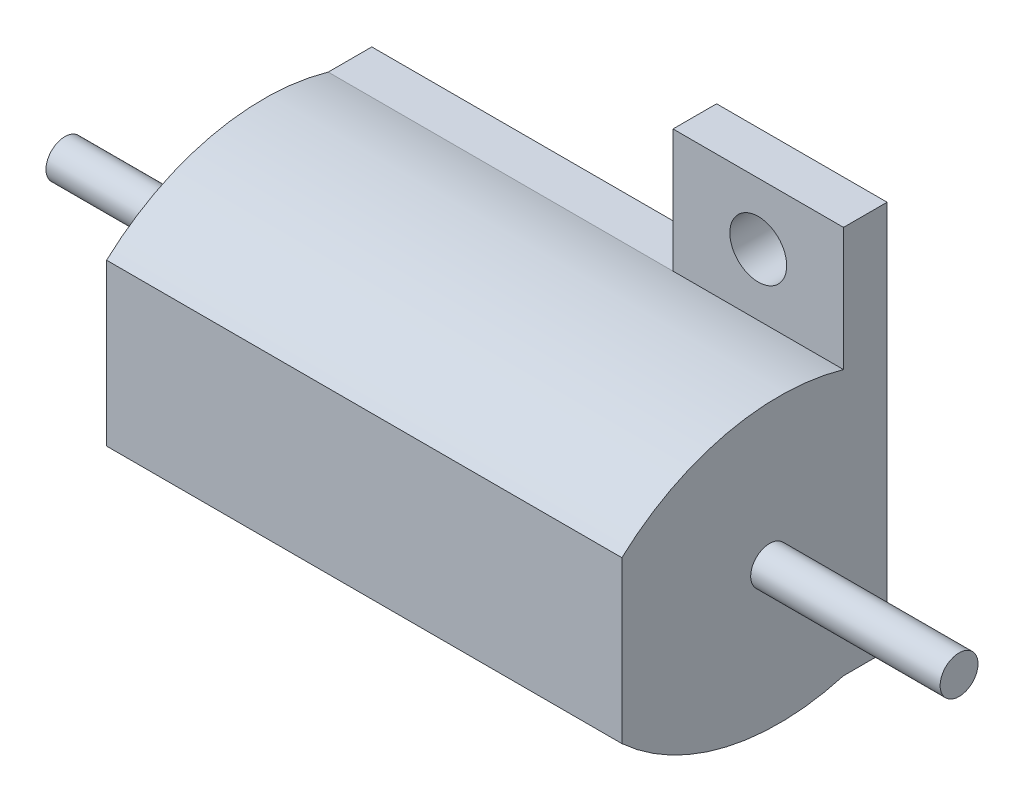
ISO-10303-21;
HEADER;
FILE_DESCRIPTION(('STEP AP214'),'2;1');
FILE_NAME('part.step','',(''),(''),'','','');
FILE_SCHEMA(('AUTOMOTIVE_DESIGN { 1 0 10303 214 1 1 1 1 }'));
ENDSEC;
DATA;
#1=APPLICATION_CONTEXT('core data for automotive mechanical design processes');
#2=APPLICATION_PROTOCOL_DEFINITION('international standard','automotive_design',2000,#1);
#3=PRODUCT_CONTEXT('',#1,'mechanical');
#4=PRODUCT('Part','Part','',(#3));
#5=PRODUCT_RELATED_PRODUCT_CATEGORY('part','',(#4));
#6=PRODUCT_DEFINITION_FORMATION('','',#4);
#7=PRODUCT_DEFINITION_CONTEXT('part definition',#1,'design');
#8=PRODUCT_DEFINITION('design','',#6,#7);
#9=PRODUCT_DEFINITION_SHAPE('','',#8);
#10=(LENGTH_UNIT() NAMED_UNIT(*) SI_UNIT(.MILLI.,.METRE.));
#11=(NAMED_UNIT(*) PLANE_ANGLE_UNIT() SI_UNIT($,.RADIAN.));
#12=(NAMED_UNIT(*) SI_UNIT($,.STERADIAN.) SOLID_ANGLE_UNIT());
#13=UNCERTAINTY_MEASURE_WITH_UNIT(LENGTH_MEASURE(1.E-05),#10,'distance_accuracy_value','');
#14=(GEOMETRIC_REPRESENTATION_CONTEXT(3) GLOBAL_UNCERTAINTY_ASSIGNED_CONTEXT((#13)) GLOBAL_UNIT_ASSIGNED_CONTEXT((#10,
#11,#12)) REPRESENTATION_CONTEXT('',''));
#15=CARTESIAN_POINT('',(0.,0.,0.));
#16=DIRECTION('',(0.,0.,1.));
#17=DIRECTION('',(1.,0.,0.));
#18=AXIS2_PLACEMENT_3D('',#15,#16,#17);
#19=CARTESIAN_POINT('',(-13.6,7.,2.3));
#20=DIRECTION('',(1.,0.,0.));
#21=DIRECTION('',(0.,0.,-1.));
#22=AXIS2_PLACEMENT_3D('',#19,#20,#21);
#23=PLANE('',#22);
#24=DIRECTION('',(0.,-1.,0.));
#25=VECTOR('',#24,1.);
#26=CARTESIAN_POINT('',(-13.6,7.,0.));
#27=LINE('',#26,#25);
#28=CARTESIAN_POINT('',(-13.6,7.,0.));
#29=VERTEX_POINT('',#28);
#30=CARTESIAN_POINT('',(-13.6,-13.5,0.));
#31=VERTEX_POINT('',#30);
#32=EDGE_CURVE('E203',#29,#31,#27,.T.);
#33=ORIENTED_EDGE('',*,*,#32,.T.);
#34=DIRECTION('',(0.,0.,-1.));
#35=VECTOR('',#34,1.);
#36=CARTESIAN_POINT('',(-13.6,-13.5,13.4018016555873));
#37=LINE('',#36,#35);
#38=CARTESIAN_POINT('',(-13.6,-13.5,2.3));
#39=VERTEX_POINT('',#38);
#40=EDGE_CURVE('E205',#39,#31,#37,.T.);
#41=ORIENTED_EDGE('',*,*,#40,.F.);
#42=DIRECTION('',(0.,-1.,0.));
#43=VECTOR('',#42,1.);
#44=CARTESIAN_POINT('',(-13.6,7.,2.3));
#45=LINE('',#44,#43);
#46=CARTESIAN_POINT('',(-13.6,-6.99999999999999,2.3));
#47=VERTEX_POINT('',#46);
#48=EDGE_CURVE('E134',#47,#39,#45,.T.);
#49=ORIENTED_EDGE('',*,*,#48,.F.);
#50=CARTESIAN_POINT('',(-13.6,4.80466934937676,5.6985819905312));
#51=DIRECTION('',(1.,0.,0.));
#52=DIRECTION('',(0.,0.,-1.));
#53=AXIS2_PLACEMENT_3D('',#50,#51,#52);
#54=CIRCLE('',#53,12.2841596372922);
#55=CARTESIAN_POINT('',(-13.6,-4.25,14.0000000000001));
#56=VERTEX_POINT('',#55);
#57=EDGE_CURVE('E167',#47,#56,#54,.F.);
#58=ORIENTED_EDGE('',*,*,#57,.T.);
#59=DIRECTION('',(0.,1.,0.));
#60=VECTOR('',#59,1.);
#61=CARTESIAN_POINT('',(-13.6,-4.25,14.0000000000001));
#62=LINE('',#61,#60);
#63=CARTESIAN_POINT('',(-13.6,4.25,14.0000000000001));
#64=VERTEX_POINT('',#63);
#65=EDGE_CURVE('E150',#56,#64,#62,.T.);
#66=ORIENTED_EDGE('',*,*,#65,.T.);
#67=CARTESIAN_POINT('',(-13.6,-4.80466934937677,5.6985819905312));
#68=DIRECTION('',(1.,0.,0.));
#69=DIRECTION('',(0.,0.,-1.));
#70=AXIS2_PLACEMENT_3D('',#67,#68,#69);
#71=CIRCLE('',#70,12.2841596372922);
#72=CARTESIAN_POINT('',(-13.6,7.,2.3));
#73=VERTEX_POINT('',#72);
#74=EDGE_CURVE('E155',#64,#73,#71,.F.);
#75=ORIENTED_EDGE('',*,*,#74,.T.);
#76=DIRECTION('',(0.,0.,-1.));
#77=VECTOR('',#76,1.);
#78=CARTESIAN_POINT('',(-13.6,7.,2.3));
#79=LINE('',#78,#77);
#80=EDGE_CURVE('E124',#73,#29,#79,.T.);
#81=ORIENTED_EDGE('',*,*,#80,.T.);
#82=EDGE_LOOP('',(#33,#41,#49,#58,#66,#75,#81));
#83=FACE_BOUND('',#82,.T.);
#84=CARTESIAN_POINT('',(-13.6,0.,6.2));
#85=DIRECTION('',(1.,0.,0.));
#86=DIRECTION('',(0.,0.,-1.));
#87=AXIS2_PLACEMENT_3D('',#84,#85,#86);
#88=CIRCLE('',#87,1.);
#89=CARTESIAN_POINT('',(-13.6,0.,5.2));
#90=VERTEX_POINT('',#89);
#91=EDGE_CURVE('E12',#90,#90,#88,.F.);
#92=ORIENTED_EDGE('',*,*,#91,.F.);
#93=EDGE_LOOP('',(#92));
#94=FACE_BOUND('',#93,.T.);
#95=ADVANCED_FACE('F31',(#83,#94),#23,.F.);
#96=CARTESIAN_POINT('',(13.6,7.,2.3));
#97=DIRECTION('',(-1.,0.,0.));
#98=DIRECTION('',(0.,-1.,0.));
#99=AXIS2_PLACEMENT_3D('',#96,#97,#98);
#100=PLANE('',#99);
#101=DIRECTION('',(0.,1.,0.));
#102=VECTOR('',#101,1.);
#103=CARTESIAN_POINT('',(13.6,7.,0.));
#104=LINE('',#103,#102);
#105=CARTESIAN_POINT('',(13.6,-6.99999999999999,0.));
#106=VERTEX_POINT('',#105);
#107=CARTESIAN_POINT('',(13.6,13.5,0.));
#108=VERTEX_POINT('',#107);
#109=EDGE_CURVE('E253',#106,#108,#104,.T.);
#110=ORIENTED_EDGE('',*,*,#109,.T.);
#111=DIRECTION('',(0.,0.,-1.));
#112=VECTOR('',#111,1.);
#113=CARTESIAN_POINT('',(13.6,13.5,13.4018016555873));
#114=LINE('',#113,#112);
#115=CARTESIAN_POINT('',(13.6,13.5,2.3));
#116=VERTEX_POINT('',#115);
#117=EDGE_CURVE('E175',#116,#108,#114,.T.);
#118=ORIENTED_EDGE('',*,*,#117,.F.);
#119=DIRECTION('',(0.,1.,0.));
#120=VECTOR('',#119,1.);
#121=CARTESIAN_POINT('',(13.6,7.,2.3));
#122=LINE('',#121,#120);
#123=CARTESIAN_POINT('',(13.6,7.,2.3));
#124=VERTEX_POINT('',#123);
#125=EDGE_CURVE('E133',#124,#116,#122,.T.);
#126=ORIENTED_EDGE('',*,*,#125,.F.);
#127=CARTESIAN_POINT('',(13.6,-4.80466934937676,5.6985819905312));
#128=DIRECTION('',(1.,0.,0.));
#129=DIRECTION('',(0.,1.,0.));
#130=AXIS2_PLACEMENT_3D('',#127,#128,#129);
#131=CIRCLE('',#130,12.2841596372922);
#132=CARTESIAN_POINT('',(13.6,4.25,14.0000000000001));
#133=VERTEX_POINT('',#132);
#134=EDGE_CURVE('E141',#124,#133,#131,.T.);
#135=ORIENTED_EDGE('',*,*,#134,.T.);
#136=DIRECTION('',(0.,-1.,0.));
#137=VECTOR('',#136,1.);
#138=CARTESIAN_POINT('',(13.6,-4.24999999999999,14.0000000000001));
#139=LINE('',#138,#137);
#140=CARTESIAN_POINT('',(13.6,-4.24999999999999,14.0000000000001));
#141=VERTEX_POINT('',#140);
#142=EDGE_CURVE('E140',#133,#141,#139,.T.);
#143=ORIENTED_EDGE('',*,*,#142,.T.);
#144=CARTESIAN_POINT('',(13.6,4.80466934937677,5.6985819905312));
#145=DIRECTION('',(1.,0.,0.));
#146=DIRECTION('',(0.,-1.,0.));
#147=AXIS2_PLACEMENT_3D('',#144,#145,#146);
#148=CIRCLE('',#147,12.2841596372922);
#149=CARTESIAN_POINT('',(13.6,-6.99999999999999,2.3));
#150=VERTEX_POINT('',#149);
#151=EDGE_CURVE('E131',#141,#150,#148,.T.);
#152=ORIENTED_EDGE('',*,*,#151,.T.);
#153=DIRECTION('',(0.,0.,-1.));
#154=VECTOR('',#153,1.);
#155=CARTESIAN_POINT('',(13.6,-6.99999999999999,2.3));
#156=LINE('',#155,#154);
#157=EDGE_CURVE('E114',#150,#106,#156,.T.);
#158=ORIENTED_EDGE('',*,*,#157,.T.);
#159=EDGE_LOOP('',(#110,#118,#126,#135,#143,#152,#158));
#160=FACE_BOUND('',#159,.T.);
#161=CARTESIAN_POINT('',(13.6,0.,6.2));
#162=DIRECTION('',(-1.,0.,0.));
#163=DIRECTION('',(0.,-1.,0.));
#164=AXIS2_PLACEMENT_3D('',#161,#162,#163);
#165=CIRCLE('',#164,1.);
#166=CARTESIAN_POINT('',(13.6,-1.,6.2));
#167=VERTEX_POINT('',#166);
#168=EDGE_CURVE('E34',#167,#167,#165,.F.);
#169=ORIENTED_EDGE('',*,*,#168,.F.);
#170=EDGE_LOOP('',(#169));
#171=FACE_BOUND('',#170,.T.);
#172=ADVANCED_FACE('F136',(#160,#171),#100,.F.);
#173=CARTESIAN_POINT('',(-13.6,-7.,2.3));
#174=DIRECTION('',(0.,0.,1.));
#175=DIRECTION('',(1.,0.,0.));
#176=AXIS2_PLACEMENT_3D('',#173,#174,#175);
#177=PLANE('',#176);
#178=CARTESIAN_POINT('',(9.1,10.25,2.3));
#179=DIRECTION('',(0.,0.,1.));
#180=DIRECTION('',(1.,0.,0.));
#181=AXIS2_PLACEMENT_3D('',#178,#179,#180);
#182=CIRCLE('',#181,1.5);
#183=CARTESIAN_POINT('',(10.6,10.25,2.3));
#184=VERTEX_POINT('',#183);
#185=EDGE_CURVE('E236',#184,#184,#182,.F.);
#186=ORIENTED_EDGE('',*,*,#185,.T.);
#187=EDGE_LOOP('',(#186));
#188=FACE_BOUND('',#187,.T.);
#189=DIRECTION('',(0.,1.,0.));
#190=VECTOR('',#189,1.);
#191=CARTESIAN_POINT('',(4.6,7.,2.3));
#192=LINE('',#191,#190);
#193=CARTESIAN_POINT('',(4.6,7.,2.3));
#194=VERTEX_POINT('',#193);
#195=CARTESIAN_POINT('',(4.6,13.5,2.3));
#196=VERTEX_POINT('',#195);
#197=EDGE_CURVE('E266',#194,#196,#192,.T.);
#198=ORIENTED_EDGE('',*,*,#197,.F.);
#199=DIRECTION('',(1.,0.,0.));
#200=VECTOR('',#199,1.);
#201=CARTESIAN_POINT('',(-32.5910794813799,6.99999999999999,2.3));
#202=LINE('',#201,#200);
#203=EDGE_CURVE('E46',#194,#124,#202,.T.);
#204=ORIENTED_EDGE('',*,*,#203,.T.);
#205=ORIENTED_EDGE('',*,*,#125,.T.);
#206=DIRECTION('',(1.,0.,0.));
#207=VECTOR('',#206,1.);
#208=CARTESIAN_POINT('',(13.6,13.5,2.3));
#209=LINE('',#208,#207);
#210=EDGE_CURVE('E169',#196,#116,#209,.T.);
#211=ORIENTED_EDGE('',*,*,#210,.F.);
#212=EDGE_LOOP('',(#198,#204,#205,#211));
#213=FACE_BOUND('',#212,.T.);
#214=ADVANCED_FACE('F199',(#188,#213),#177,.T.);
#215=CARTESIAN_POINT('',(-13.6,-7.,2.3));
#216=DIRECTION('',(0.,1.,0.));
#217=DIRECTION('',(-1.,0.,0.));
#218=AXIS2_PLACEMENT_3D('',#215,#216,#217);
#219=PLANE('',#218);
#220=DIRECTION('',(1.,0.,0.));
#221=VECTOR('',#220,1.);
#222=CARTESIAN_POINT('',(-13.6,-7.,2.3));
#223=LINE('',#222,#221);
#224=CARTESIAN_POINT('',(-4.59999999999999,-7.,2.3));
#225=VERTEX_POINT('',#224);
#226=EDGE_CURVE('E118',#225,#150,#223,.T.);
#227=ORIENTED_EDGE('',*,*,#226,.F.);
#228=DIRECTION('',(0.,0.,-1.));
#229=VECTOR('',#228,1.);
#230=CARTESIAN_POINT('',(-4.59999999999999,-7.,13.4018016555873));
#231=LINE('',#230,#229);
#232=CARTESIAN_POINT('',(-4.59999999999999,-7.,0.));
#233=VERTEX_POINT('',#232);
#234=EDGE_CURVE('E234',#225,#233,#231,.T.);
#235=ORIENTED_EDGE('',*,*,#234,.T.);
#236=DIRECTION('',(1.,0.,0.));
#237=VECTOR('',#236,1.);
#238=CARTESIAN_POINT('',(-13.6,-7.,0.));
#239=LINE('',#238,#237);
#240=EDGE_CURVE('E120',#233,#106,#239,.T.);
#241=ORIENTED_EDGE('',*,*,#240,.T.);
#242=ORIENTED_EDGE('',*,*,#157,.F.);
#243=EDGE_LOOP('',(#227,#235,#241,#242));
#244=FACE_BOUND('',#243,.T.);
#245=ADVANCED_FACE('F116',(#244),#219,.F.);
#246=CARTESIAN_POINT('',(-13.6,7.,2.3));
#247=DIRECTION('',(0.,-1.,0.));
#248=DIRECTION('',(1.,0.,0.));
#249=AXIS2_PLACEMENT_3D('',#246,#247,#248);
#250=PLANE('',#249);
#251=DIRECTION('',(-1.,0.,0.));
#252=VECTOR('',#251,1.);
#253=CARTESIAN_POINT('',(-13.6,7.,2.3));
#254=LINE('',#253,#252);
#255=EDGE_CURVE('E254',#194,#73,#254,.T.);
#256=ORIENTED_EDGE('',*,*,#255,.F.);
#257=DIRECTION('',(0.,0.,-1.));
#258=VECTOR('',#257,1.);
#259=CARTESIAN_POINT('',(4.6,7.,13.4018016555873));
#260=LINE('',#259,#258);
#261=CARTESIAN_POINT('',(4.6,7.,0.));
#262=VERTEX_POINT('',#261);
#263=EDGE_CURVE('E270',#194,#262,#260,.T.);
#264=ORIENTED_EDGE('',*,*,#263,.T.);
#265=DIRECTION('',(-1.,0.,0.));
#266=VECTOR('',#265,1.);
#267=CARTESIAN_POINT('',(-13.6,7.,0.));
#268=LINE('',#267,#266);
#269=EDGE_CURVE('E250',#262,#29,#268,.T.);
#270=ORIENTED_EDGE('',*,*,#269,.T.);
#271=ORIENTED_EDGE('',*,*,#80,.F.);
#272=EDGE_LOOP('',(#256,#264,#270,#271));
#273=FACE_BOUND('',#272,.T.);
#274=ADVANCED_FACE('F340',(#273),#250,.F.);
#275=DIRECTION('',(1.,0.,0.));
#276=VECTOR('',#275,1.);
#277=CARTESIAN_POINT('',(-32.5910794813799,-7.00000000000001,2.3));
#278=LINE('',#277,#276);
#279=EDGE_CURVE('E54',#47,#225,#278,.T.);
#280=ORIENTED_EDGE('',*,*,#279,.F.);
#281=ORIENTED_EDGE('',*,*,#48,.T.);
#282=DIRECTION('',(-1.,0.,0.));
#283=VECTOR('',#282,1.);
#284=CARTESIAN_POINT('',(-13.6,-13.5,2.3));
#285=LINE('',#284,#283);
#286=CARTESIAN_POINT('',(-4.6,-13.5,2.3));
#287=VERTEX_POINT('',#286);
#288=EDGE_CURVE('E217',#287,#39,#285,.T.);
#289=ORIENTED_EDGE('',*,*,#288,.F.);
#290=DIRECTION('',(0.,-1.,0.));
#291=VECTOR('',#290,1.);
#292=CARTESIAN_POINT('',(-4.59999999999999,-7.,2.3));
#293=LINE('',#292,#291);
#294=EDGE_CURVE('E218',#225,#287,#293,.T.);
#295=ORIENTED_EDGE('',*,*,#294,.F.);
#296=EDGE_LOOP('',(#280,#281,#289,#295));
#297=FACE_BOUND('',#296,.T.);
#298=CARTESIAN_POINT('',(-9.1,-10.25,2.3));
#299=DIRECTION('',(0.,0.,1.));
#300=DIRECTION('',(1.,0.,0.));
#301=AXIS2_PLACEMENT_3D('',#298,#299,#300);
#302=CIRCLE('',#301,1.5);
#303=CARTESIAN_POINT('',(-7.6,-10.25,2.3));
#304=VERTEX_POINT('',#303);
#305=EDGE_CURVE('E210',#304,#304,#302,.F.);
#306=ORIENTED_EDGE('',*,*,#305,.T.);
#307=EDGE_LOOP('',(#306));
#308=FACE_BOUND('',#307,.T.);
#309=ADVANCED_FACE('F337',(#297,#308),#177,.T.);
#310=CARTESIAN_POINT('',(-13.6,-7.,0.));
#311=DIRECTION('',(0.,0.,1.));
#312=DIRECTION('',(1.,0.,0.));
#313=AXIS2_PLACEMENT_3D('',#310,#311,#312);
#314=PLANE('',#313);
#315=ORIENTED_EDGE('',*,*,#32,.F.);
#316=ORIENTED_EDGE('',*,*,#269,.F.);
#317=DIRECTION('',(0.,1.,0.));
#318=VECTOR('',#317,1.);
#319=CARTESIAN_POINT('',(4.6,7.,0.));
#320=LINE('',#319,#318);
#321=CARTESIAN_POINT('',(4.6,13.5,0.));
#322=VERTEX_POINT('',#321);
#323=EDGE_CURVE('E275',#262,#322,#320,.T.);
#324=ORIENTED_EDGE('',*,*,#323,.T.);
#325=DIRECTION('',(1.,0.,0.));
#326=VECTOR('',#325,1.);
#327=CARTESIAN_POINT('',(13.6,13.5,0.));
#328=LINE('',#327,#326);
#329=EDGE_CURVE('E277',#322,#108,#328,.T.);
#330=ORIENTED_EDGE('',*,*,#329,.T.);
#331=ORIENTED_EDGE('',*,*,#109,.F.);
#332=ORIENTED_EDGE('',*,*,#240,.F.);
#333=DIRECTION('',(0.,-1.,0.));
#334=VECTOR('',#333,1.);
#335=CARTESIAN_POINT('',(-4.59999999999999,-7.,0.));
#336=LINE('',#335,#334);
#337=CARTESIAN_POINT('',(-4.6,-13.5,0.));
#338=VERTEX_POINT('',#337);
#339=EDGE_CURVE('E223',#233,#338,#336,.T.);
#340=ORIENTED_EDGE('',*,*,#339,.T.);
#341=DIRECTION('',(-1.,0.,0.));
#342=VECTOR('',#341,1.);
#343=CARTESIAN_POINT('',(-13.6,-13.5,0.));
#344=LINE('',#343,#342);
#345=EDGE_CURVE('E216',#338,#31,#344,.T.);
#346=ORIENTED_EDGE('',*,*,#345,.T.);
#347=EDGE_LOOP('',(#315,#316,#324,#330,#331,#332,#340,#346));
#348=FACE_BOUND('',#347,.T.);
#349=CARTESIAN_POINT('',(-9.1,-10.25,0.));
#350=DIRECTION('',(0.,0.,-1.));
#351=DIRECTION('',(-1.,0.,0.));
#352=AXIS2_PLACEMENT_3D('',#349,#350,#351);
#353=CIRCLE('',#352,1.5);
#354=CARTESIAN_POINT('',(-10.6,-10.25,0.));
#355=VERTEX_POINT('',#354);
#356=EDGE_CURVE('E227',#355,#355,#353,.T.);
#357=ORIENTED_EDGE('',*,*,#356,.F.);
#358=EDGE_LOOP('',(#357));
#359=FACE_BOUND('',#358,.T.);
#360=CARTESIAN_POINT('',(9.1,10.25,0.));
#361=DIRECTION('',(0.,0.,-1.));
#362=DIRECTION('',(-1.,0.,0.));
#363=AXIS2_PLACEMENT_3D('',#360,#361,#362);
#364=CIRCLE('',#363,1.5);
#365=CARTESIAN_POINT('',(7.6,10.25,0.));
#366=VERTEX_POINT('',#365);
#367=EDGE_CURVE('E273',#366,#366,#364,.T.);
#368=ORIENTED_EDGE('',*,*,#367,.F.);
#369=EDGE_LOOP('',(#368));
#370=FACE_BOUND('',#369,.T.);
#371=ADVANCED_FACE('F221',(#348,#359,#370),#314,.F.);
#372=CARTESIAN_POINT('',(-13.6,-13.5,13.4018016555873));
#373=DIRECTION('',(0.,-1.,0.));
#374=DIRECTION('',(1.,0.,0.));
#375=AXIS2_PLACEMENT_3D('',#372,#373,#374);
#376=PLANE('',#375);
#377=DIRECTION('',(0.,0.,-1.));
#378=VECTOR('',#377,1.);
#379=CARTESIAN_POINT('',(-4.6,-13.5,13.4018016555873));
#380=LINE('',#379,#378);
#381=EDGE_CURVE('E238',#287,#338,#380,.T.);
#382=ORIENTED_EDGE('',*,*,#381,.F.);
#383=ORIENTED_EDGE('',*,*,#288,.T.);
#384=ORIENTED_EDGE('',*,*,#40,.T.);
#385=ORIENTED_EDGE('',*,*,#345,.F.);
#386=EDGE_LOOP('',(#382,#383,#384,#385));
#387=FACE_BOUND('',#386,.T.);
#388=ADVANCED_FACE('F215',(#387),#376,.T.);
#389=CARTESIAN_POINT('',(-4.59999999999999,-7.,13.4018016555873));
#390=DIRECTION('',(1.,0.,0.));
#391=DIRECTION('',(0.,1.,0.));
#392=AXIS2_PLACEMENT_3D('',#389,#390,#391);
#393=PLANE('',#392);
#394=ORIENTED_EDGE('',*,*,#234,.F.);
#395=ORIENTED_EDGE('',*,*,#294,.T.);
#396=ORIENTED_EDGE('',*,*,#381,.T.);
#397=ORIENTED_EDGE('',*,*,#339,.F.);
#398=EDGE_LOOP('',(#394,#395,#396,#397));
#399=FACE_BOUND('',#398,.T.);
#400=ADVANCED_FACE('F326',(#399),#393,.T.);
#401=CARTESIAN_POINT('',(-9.1,-10.25,13.4018016555873));
#402=DIRECTION('',(0.,0.,-1.));
#403=DIRECTION('',(-1.,0.,0.));
#404=AXIS2_PLACEMENT_3D('',#401,#402,#403);
#405=CYLINDRICAL_SURFACE('',#404,1.5);
#406=ORIENTED_EDGE('',*,*,#356,.T.);
#407=EDGE_LOOP('',(#406));
#408=FACE_BOUND('',#407,.T.);
#409=ORIENTED_EDGE('',*,*,#305,.F.);
#410=EDGE_LOOP('',(#409));
#411=FACE_BOUND('',#410,.T.);
#412=ADVANCED_FACE('F323',(#408,#411),#405,.F.);
#413=CARTESIAN_POINT('',(13.6,13.5,13.4018016555873));
#414=DIRECTION('',(0.,1.,0.));
#415=DIRECTION('',(0.,0.,1.));
#416=AXIS2_PLACEMENT_3D('',#413,#414,#415);
#417=PLANE('',#416);
#418=DIRECTION('',(0.,0.,-1.));
#419=VECTOR('',#418,1.);
#420=CARTESIAN_POINT('',(4.6,13.5,13.4018016555873));
#421=LINE('',#420,#419);
#422=EDGE_CURVE('E269',#196,#322,#421,.T.);
#423=ORIENTED_EDGE('',*,*,#422,.F.);
#424=ORIENTED_EDGE('',*,*,#210,.T.);
#425=ORIENTED_EDGE('',*,*,#117,.T.);
#426=ORIENTED_EDGE('',*,*,#329,.F.);
#427=EDGE_LOOP('',(#423,#424,#425,#426));
#428=FACE_BOUND('',#427,.T.);
#429=ADVANCED_FACE('F294',(#428),#417,.T.);
#430=CARTESIAN_POINT('',(4.6,7.,13.4018016555873));
#431=DIRECTION('',(-1.,0.,0.));
#432=DIRECTION('',(0.,-1.,0.));
#433=AXIS2_PLACEMENT_3D('',#430,#431,#432);
#434=PLANE('',#433);
#435=ORIENTED_EDGE('',*,*,#263,.F.);
#436=ORIENTED_EDGE('',*,*,#197,.T.);
#437=ORIENTED_EDGE('',*,*,#422,.T.);
#438=ORIENTED_EDGE('',*,*,#323,.F.);
#439=EDGE_LOOP('',(#435,#436,#437,#438));
#440=FACE_BOUND('',#439,.T.);
#441=ADVANCED_FACE('F292',(#440),#434,.T.);
#442=CARTESIAN_POINT('',(9.1,10.25,13.4018016555873));
#443=DIRECTION('',(0.,0.,-1.));
#444=DIRECTION('',(-1.,0.,0.));
#445=AXIS2_PLACEMENT_3D('',#442,#443,#444);
#446=CYLINDRICAL_SURFACE('',#445,1.5);
#447=ORIENTED_EDGE('',*,*,#367,.T.);
#448=EDGE_LOOP('',(#447));
#449=FACE_BOUND('',#448,.T.);
#450=ORIENTED_EDGE('',*,*,#185,.F.);
#451=EDGE_LOOP('',(#450));
#452=FACE_BOUND('',#451,.T.);
#453=ADVANCED_FACE('F315',(#449,#452),#446,.F.);
#454=CARTESIAN_POINT('',(-32.5910794813799,4.80466934937676,5.6985819905312));
#455=DIRECTION('',(1.,0.,0.));
#456=DIRECTION('',(0.,1.,0.));
#457=AXIS2_PLACEMENT_3D('',#454,#455,#456);
#458=CYLINDRICAL_SURFACE('',#457,12.2841596372922);
#459=ORIENTED_EDGE('',*,*,#57,.F.);
#460=ORIENTED_EDGE('',*,*,#279,.T.);
#461=ORIENTED_EDGE('',*,*,#226,.T.);
#462=ORIENTED_EDGE('',*,*,#151,.F.);
#463=DIRECTION('',(1.,0.,0.));
#464=VECTOR('',#463,1.);
#465=CARTESIAN_POINT('',(-32.5910794813799,-4.25,14.0000000000001));
#466=LINE('',#465,#464);
#467=EDGE_CURVE('E153',#56,#141,#466,.T.);
#468=ORIENTED_EDGE('',*,*,#467,.F.);
#469=EDGE_LOOP('',(#459,#460,#461,#462,#468));
#470=FACE_BOUND('',#469,.T.);
#471=ADVANCED_FACE('F129',(#470),#458,.T.);
#472=CARTESIAN_POINT('',(-32.5910794813799,-4.25,14.0000000000001));
#473=DIRECTION('',(0.,0.,1.));
#474=DIRECTION('',(0.,-1.,0.));
#475=AXIS2_PLACEMENT_3D('',#472,#473,#474);
#476=PLANE('',#475);
#477=ORIENTED_EDGE('',*,*,#65,.F.);
#478=ORIENTED_EDGE('',*,*,#467,.T.);
#479=ORIENTED_EDGE('',*,*,#142,.F.);
#480=DIRECTION('',(1.,0.,0.));
#481=VECTOR('',#480,1.);
#482=CARTESIAN_POINT('',(-32.5910794813799,4.24999999999999,14.0000000000001));
#483=LINE('',#482,#481);
#484=EDGE_CURVE('E156',#64,#133,#483,.T.);
#485=ORIENTED_EDGE('',*,*,#484,.F.);
#486=EDGE_LOOP('',(#477,#478,#479,#485));
#487=FACE_BOUND('',#486,.T.);
#488=ADVANCED_FACE('F307',(#487),#476,.T.);
#489=CARTESIAN_POINT('',(-32.5910794813799,-4.80466934937677,5.6985819905312));
#490=DIRECTION('',(1.,0.,0.));
#491=DIRECTION('',(0.,1.,0.));
#492=AXIS2_PLACEMENT_3D('',#489,#490,#491);
#493=CYLINDRICAL_SURFACE('',#492,12.2841596372922);
#494=ORIENTED_EDGE('',*,*,#74,.F.);
#495=ORIENTED_EDGE('',*,*,#484,.T.);
#496=ORIENTED_EDGE('',*,*,#134,.F.);
#497=ORIENTED_EDGE('',*,*,#203,.F.);
#498=ORIENTED_EDGE('',*,*,#255,.T.);
#499=EDGE_LOOP('',(#494,#495,#496,#497,#498));
#500=FACE_BOUND('',#499,.T.);
#501=ADVANCED_FACE('F304',(#500),#493,.T.);
#502=CARTESIAN_POINT('',(23.6,7.00000000000001,2.3));
#503=DIRECTION('',(-1.,0.,0.));
#504=DIRECTION('',(0.,-1.,0.));
#505=AXIS2_PLACEMENT_3D('',#502,#503,#504);
#506=PLANE('',#505);
#507=CARTESIAN_POINT('',(23.6,0.,6.2));
#508=DIRECTION('',(-1.,0.,0.));
#509=DIRECTION('',(0.,-1.,0.));
#510=AXIS2_PLACEMENT_3D('',#507,#508,#509);
#511=CIRCLE('',#510,1.);
#512=CARTESIAN_POINT('',(23.6,-1.,6.2));
#513=VERTEX_POINT('',#512);
#514=EDGE_CURVE('E142',#513,#513,#511,.T.);
#515=ORIENTED_EDGE('',*,*,#514,.F.);
#516=EDGE_LOOP('',(#515));
#517=FACE_BOUND('',#516,.T.);
#518=ADVANCED_FACE('F313',(#517),#506,.F.);
#519=CARTESIAN_POINT('',(36.4284271247462,0.,6.2));
#520=DIRECTION('',(-1.,0.,0.));
#521=DIRECTION('',(0.,0.,1.));
#522=AXIS2_PLACEMENT_3D('',#519,#520,#521);
#523=CYLINDRICAL_SURFACE('',#522,1.);
#524=ORIENTED_EDGE('',*,*,#514,.T.);
#525=EDGE_LOOP('',(#524));
#526=FACE_BOUND('',#525,.T.);
#527=ORIENTED_EDGE('',*,*,#168,.T.);
#528=EDGE_LOOP('',(#527));
#529=FACE_BOUND('',#528,.T.);
#530=ADVANCED_FACE('F190',(#526,#529),#523,.T.);
#531=CARTESIAN_POINT('',(-23.6,0.,6.2));
#532=DIRECTION('',(1.,0.,0.));
#533=DIRECTION('',(0.,0.,-1.));
#534=AXIS2_PLACEMENT_3D('',#531,#532,#533);
#535=CIRCLE('',#534,1.);
#536=CARTESIAN_POINT('',(-23.6,0.,5.2));
#537=VERTEX_POINT('',#536);
#538=EDGE_CURVE('E146',#537,#537,#535,.F.);
#539=ORIENTED_EDGE('',*,*,#538,.F.);
#540=EDGE_LOOP('',(#539));
#541=FACE_BOUND('',#540,.T.);
#542=ORIENTED_EDGE('',*,*,#91,.T.);
#543=EDGE_LOOP('',(#542));
#544=FACE_BOUND('',#543,.T.);
#545=ADVANCED_FACE('F187',(#541,#544),#523,.T.);
#546=CARTESIAN_POINT('',(-23.6,7.,2.3));
#547=DIRECTION('',(1.,0.,0.));
#548=DIRECTION('',(0.,0.,-1.));
#549=AXIS2_PLACEMENT_3D('',#546,#547,#548);
#550=PLANE('',#549);
#551=ORIENTED_EDGE('',*,*,#538,.T.);
#552=EDGE_LOOP('',(#551));
#553=FACE_BOUND('',#552,.T.);
#554=ADVANCED_FACE('F185',(#553),#550,.F.);
#555=CLOSED_SHELL('',(#95,#172,#214,#245,#274,#309,#371,#388,#400,#412,#429,#441,#453,#471,#488,
#501,#518,#530,#545,#554));
#556=MANIFOLD_SOLID_BREP('B2',#555);
#557=ADVANCED_BREP_SHAPE_REPRESENTATION('',(#18,#556),#14);
#558=SHAPE_DEFINITION_REPRESENTATION(#9,#557);
ENDSEC;
END-ISO-10303-21;
